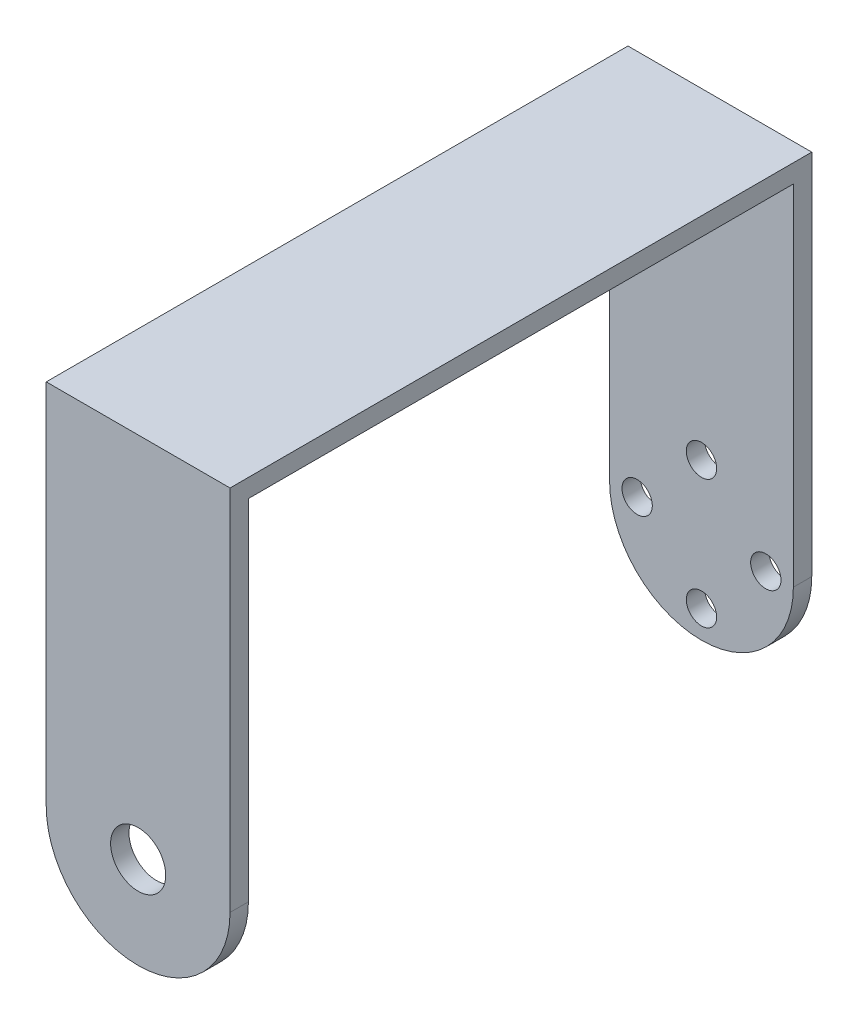
ISO-10303-21;
HEADER;
FILE_DESCRIPTION(('STEP AP214'),'2;1');
FILE_NAME('part.step','',(''),(''),'','','');
FILE_SCHEMA(('AUTOMOTIVE_DESIGN { 1 0 10303 214 1 1 1 1 }'));
ENDSEC;
DATA;
#1=APPLICATION_CONTEXT('core data for automotive mechanical design processes');
#2=APPLICATION_PROTOCOL_DEFINITION('international standard','automotive_design',2000,#1);
#3=PRODUCT_CONTEXT('',#1,'mechanical');
#4=PRODUCT('Part','Part','',(#3));
#5=PRODUCT_RELATED_PRODUCT_CATEGORY('part','',(#4));
#6=PRODUCT_DEFINITION_FORMATION('','',#4);
#7=PRODUCT_DEFINITION_CONTEXT('part definition',#1,'design');
#8=PRODUCT_DEFINITION('design','',#6,#7);
#9=PRODUCT_DEFINITION_SHAPE('','',#8);
#10=(LENGTH_UNIT() NAMED_UNIT(*) SI_UNIT(.MILLI.,.METRE.));
#11=(NAMED_UNIT(*) PLANE_ANGLE_UNIT() SI_UNIT($,.RADIAN.));
#12=(NAMED_UNIT(*) SI_UNIT($,.STERADIAN.) SOLID_ANGLE_UNIT());
#13=UNCERTAINTY_MEASURE_WITH_UNIT(LENGTH_MEASURE(1.E-05),#10,'distance_accuracy_value','');
#14=(GEOMETRIC_REPRESENTATION_CONTEXT(3) GLOBAL_UNCERTAINTY_ASSIGNED_CONTEXT((#13)) GLOBAL_UNIT_ASSIGNED_CONTEXT((#10,
#11,#12)) REPRESENTATION_CONTEXT('',''));
#15=CARTESIAN_POINT('',(0.,0.,0.));
#16=DIRECTION('',(0.,0.,1.));
#17=DIRECTION('',(1.,0.,0.));
#18=AXIS2_PLACEMENT_3D('',#15,#16,#17);
#19=CARTESIAN_POINT('',(0.,38.,63.3));
#20=DIRECTION('',(0.,1.,0.));
#21=DIRECTION('',(0.,0.,1.));
#22=AXIS2_PLACEMENT_3D('',#19,#20,#21);
#23=PLANE('',#22);
#24=DIRECTION('',(1.,0.,0.));
#25=VECTOR('',#24,1.);
#26=CARTESIAN_POINT('',(0.,38.,61.3));
#27=LINE('',#26,#25);
#28=CARTESIAN_POINT('',(0.,38.,61.3));
#29=VERTEX_POINT('',#28);
#30=CARTESIAN_POINT('',(20.,38.,61.3));
#31=VERTEX_POINT('',#30);
#32=EDGE_CURVE('E11',#29,#31,#27,.T.);
#33=ORIENTED_EDGE('',*,*,#32,.F.);
#34=DIRECTION('',(0.,0.,-1.));
#35=VECTOR('',#34,1.);
#36=CARTESIAN_POINT('',(0.,38.,63.3));
#37=LINE('',#36,#35);
#38=CARTESIAN_POINT('',(0.,38.,2.));
#39=VERTEX_POINT('',#38);
#40=EDGE_CURVE('E55',#29,#39,#37,.T.);
#41=ORIENTED_EDGE('',*,*,#40,.T.);
#42=DIRECTION('',(1.,0.,0.));
#43=VECTOR('',#42,1.);
#44=CARTESIAN_POINT('',(0.,38.,2.));
#45=LINE('',#44,#43);
#46=CARTESIAN_POINT('',(20.,38.,2.));
#47=VERTEX_POINT('',#46);
#48=EDGE_CURVE('E143',#39,#47,#45,.T.);
#49=ORIENTED_EDGE('',*,*,#48,.T.);
#50=DIRECTION('',(0.,0.,-1.));
#51=VECTOR('',#50,1.);
#52=CARTESIAN_POINT('',(20.,38.,63.3));
#53=LINE('',#52,#51);
#54=EDGE_CURVE('E113',#31,#47,#53,.T.);
#55=ORIENTED_EDGE('',*,*,#54,.F.);
#56=EDGE_LOOP('',(#33,#41,#49,#55));
#57=FACE_BOUND('',#56,.T.);
#58=ADVANCED_FACE('F39',(#57),#23,.F.);
#59=CARTESIAN_POINT('',(10.,0.,2.));
#60=DIRECTION('',(0.,0.,-1.));
#61=DIRECTION('',(-1.,0.,0.));
#62=AXIS2_PLACEMENT_3D('',#59,#60,#61);
#63=PLANE('',#62);
#64=CARTESIAN_POINT('',(10.,-7.,2.));
#65=DIRECTION('',(0.,0.,-1.));
#66=DIRECTION('',(-1.,0.,0.));
#67=AXIS2_PLACEMENT_3D('',#64,#65,#66);
#68=CIRCLE('',#67,1.65);
#69=CARTESIAN_POINT('',(8.35,-7.,2.));
#70=VERTEX_POINT('',#69);
#71=EDGE_CURVE('E188',#70,#70,#68,.F.);
#72=ORIENTED_EDGE('',*,*,#71,.F.);
#73=EDGE_LOOP('',(#72));
#74=FACE_BOUND('',#73,.T.);
#75=CARTESIAN_POINT('',(17.,0.,2.));
#76=DIRECTION('',(0.,0.,-1.));
#77=DIRECTION('',(-1.,0.,0.));
#78=AXIS2_PLACEMENT_3D('',#75,#76,#77);
#79=CIRCLE('',#78,1.65);
#80=CARTESIAN_POINT('',(15.35,0.,2.));
#81=VERTEX_POINT('',#80);
#82=EDGE_CURVE('E209',#81,#81,#79,.F.);
#83=ORIENTED_EDGE('',*,*,#82,.F.);
#84=EDGE_LOOP('',(#83));
#85=FACE_BOUND('',#84,.T.);
#86=CARTESIAN_POINT('',(9.99999999999995,6.99999999999993,2.));
#87=DIRECTION('',(0.,0.,-1.));
#88=DIRECTION('',(-1.,0.,0.));
#89=AXIS2_PLACEMENT_3D('',#86,#87,#88);
#90=CIRCLE('',#89,1.65);
#91=CARTESIAN_POINT('',(8.34999999999995,6.99999999999993,2.));
#92=VERTEX_POINT('',#91);
#93=EDGE_CURVE('E201',#92,#92,#90,.F.);
#94=ORIENTED_EDGE('',*,*,#93,.F.);
#95=EDGE_LOOP('',(#94));
#96=FACE_BOUND('',#95,.T.);
#97=CARTESIAN_POINT('',(3.00000000000004,-1.05818132034585E-13,2.));
#98=DIRECTION('',(0.,0.,-1.));
#99=DIRECTION('',(-1.,0.,0.));
#100=AXIS2_PLACEMENT_3D('',#97,#98,#99);
#101=CIRCLE('',#100,1.65);
#102=CARTESIAN_POINT('',(1.35000000000004,-1.05818132034585E-13,2.));
#103=VERTEX_POINT('',#102);
#104=EDGE_CURVE('E193',#103,#103,#101,.F.);
#105=ORIENTED_EDGE('',*,*,#104,.F.);
#106=EDGE_LOOP('',(#105));
#107=FACE_BOUND('',#106,.T.);
#108=ORIENTED_EDGE('',*,*,#48,.F.);
#109=DIRECTION('',(0.,-1.,0.));
#110=VECTOR('',#109,1.);
#111=CARTESIAN_POINT('',(0.,0.,2.));
#112=LINE('',#111,#110);
#113=CARTESIAN_POINT('',(0.,0.,2.));
#114=VERTEX_POINT('',#113);
#115=EDGE_CURVE('E63',#39,#114,#112,.T.);
#116=ORIENTED_EDGE('',*,*,#115,.T.);
#117=CARTESIAN_POINT('',(10.,0.,2.));
#118=DIRECTION('',(0.,0.,1.));
#119=DIRECTION('',(-1.,0.,0.));
#120=AXIS2_PLACEMENT_3D('',#117,#118,#119);
#121=CIRCLE('',#120,10.);
#122=CARTESIAN_POINT('',(20.,0.,2.));
#123=VERTEX_POINT('',#122);
#124=EDGE_CURVE('E95',#114,#123,#121,.T.);
#125=ORIENTED_EDGE('',*,*,#124,.T.);
#126=DIRECTION('',(0.,1.,0.));
#127=VECTOR('',#126,1.);
#128=CARTESIAN_POINT('',(20.,0.,2.));
#129=LINE('',#128,#127);
#130=EDGE_CURVE('E131',#123,#47,#129,.T.);
#131=ORIENTED_EDGE('',*,*,#130,.T.);
#132=EDGE_LOOP('',(#108,#116,#125,#131));
#133=FACE_BOUND('',#132,.T.);
#134=ADVANCED_FACE('F136',(#74,#85,#96,#107,#133),#63,.F.);
#135=CARTESIAN_POINT('',(10.,0.,2.));
#136=DIRECTION('',(0.,0.,-1.));
#137=DIRECTION('',(-1.,0.,0.));
#138=AXIS2_PLACEMENT_3D('',#135,#136,#137);
#139=CYLINDRICAL_SURFACE('',#138,10.);
#140=CARTESIAN_POINT('',(10.,0.,0.));
#141=DIRECTION('',(0.,0.,1.));
#142=DIRECTION('',(-1.,0.,0.));
#143=AXIS2_PLACEMENT_3D('',#140,#141,#142);
#144=CIRCLE('',#143,10.);
#145=CARTESIAN_POINT('',(0.,0.,0.));
#146=VERTEX_POINT('',#145);
#147=CARTESIAN_POINT('',(20.,0.,0.));
#148=VERTEX_POINT('',#147);
#149=EDGE_CURVE('E101',#146,#148,#144,.T.);
#150=ORIENTED_EDGE('',*,*,#149,.T.);
#151=DIRECTION('',(0.,0.,-1.));
#152=VECTOR('',#151,1.);
#153=CARTESIAN_POINT('',(20.,0.,2.));
#154=LINE('',#153,#152);
#155=EDGE_CURVE('E48',#123,#148,#154,.T.);
#156=ORIENTED_EDGE('',*,*,#155,.F.);
#157=ORIENTED_EDGE('',*,*,#124,.F.);
#158=DIRECTION('',(0.,0.,-1.));
#159=VECTOR('',#158,1.);
#160=CARTESIAN_POINT('',(0.,0.,2.));
#161=LINE('',#160,#159);
#162=EDGE_CURVE('E85',#114,#146,#161,.T.);
#163=ORIENTED_EDGE('',*,*,#162,.T.);
#164=EDGE_LOOP('',(#150,#156,#157,#163));
#165=FACE_BOUND('',#164,.T.);
#166=ADVANCED_FACE('F41',(#165),#139,.T.);
#167=CARTESIAN_POINT('',(20.,0.,2.));
#168=DIRECTION('',(-1.,0.,0.));
#169=DIRECTION('',(0.,0.,1.));
#170=AXIS2_PLACEMENT_3D('',#167,#168,#169);
#171=PLANE('',#170);
#172=DIRECTION('',(0.,1.,0.));
#173=VECTOR('',#172,1.);
#174=CARTESIAN_POINT('',(20.,40.,63.3));
#175=LINE('',#174,#173);
#176=CARTESIAN_POINT('',(20.,0.,63.3));
#177=VERTEX_POINT('',#176);
#178=CARTESIAN_POINT('',(20.,40.,63.3));
#179=VERTEX_POINT('',#178);
#180=EDGE_CURVE('E151',#177,#179,#175,.T.);
#181=ORIENTED_EDGE('',*,*,#180,.F.);
#182=DIRECTION('',(0.,0.,1.));
#183=VECTOR('',#182,1.);
#184=CARTESIAN_POINT('',(20.,0.,61.3));
#185=LINE('',#184,#183);
#186=CARTESIAN_POINT('',(20.,0.,61.3));
#187=VERTEX_POINT('',#186);
#188=EDGE_CURVE('E161',#187,#177,#185,.T.);
#189=ORIENTED_EDGE('',*,*,#188,.F.);
#190=DIRECTION('',(0.,1.,0.));
#191=VECTOR('',#190,1.);
#192=CARTESIAN_POINT('',(20.,0.,61.3));
#193=LINE('',#192,#191);
#194=EDGE_CURVE('E165',#187,#31,#193,.T.);
#195=ORIENTED_EDGE('',*,*,#194,.T.);
#196=ORIENTED_EDGE('',*,*,#54,.T.);
#197=ORIENTED_EDGE('',*,*,#130,.F.);
#198=ORIENTED_EDGE('',*,*,#155,.T.);
#199=DIRECTION('',(0.,1.,0.));
#200=VECTOR('',#199,1.);
#201=CARTESIAN_POINT('',(20.,0.,0.));
#202=LINE('',#201,#200);
#203=CARTESIAN_POINT('',(20.,40.,0.));
#204=VERTEX_POINT('',#203);
#205=EDGE_CURVE('E106',#148,#204,#202,.T.);
#206=ORIENTED_EDGE('',*,*,#205,.T.);
#207=DIRECTION('',(0.,0.,-1.));
#208=VECTOR('',#207,1.);
#209=CARTESIAN_POINT('',(20.,40.,2.));
#210=LINE('',#209,#208);
#211=EDGE_CURVE('E122',#179,#204,#210,.T.);
#212=ORIENTED_EDGE('',*,*,#211,.F.);
#213=EDGE_LOOP('',(#181,#189,#195,#196,#197,#198,#206,#212));
#214=FACE_BOUND('',#213,.T.);
#215=ADVANCED_FACE('F127',(#214),#171,.F.);
#216=CARTESIAN_POINT('',(0.,40.,2.));
#217=DIRECTION('',(0.,-1.,0.));
#218=DIRECTION('',(0.,0.,-1.));
#219=AXIS2_PLACEMENT_3D('',#216,#217,#218);
#220=PLANE('',#219);
#221=ORIENTED_EDGE('',*,*,#211,.T.);
#222=DIRECTION('',(-1.,0.,0.));
#223=VECTOR('',#222,1.);
#224=CARTESIAN_POINT('',(0.,40.,0.));
#225=LINE('',#224,#223);
#226=CARTESIAN_POINT('',(0.,40.,0.));
#227=VERTEX_POINT('',#226);
#228=EDGE_CURVE('E96',#204,#227,#225,.T.);
#229=ORIENTED_EDGE('',*,*,#228,.T.);
#230=DIRECTION('',(0.,0.,-1.));
#231=VECTOR('',#230,1.);
#232=CARTESIAN_POINT('',(0.,40.,2.));
#233=LINE('',#232,#231);
#234=CARTESIAN_POINT('',(0.,40.,63.3));
#235=VERTEX_POINT('',#234);
#236=EDGE_CURVE('E89',#235,#227,#233,.T.);
#237=ORIENTED_EDGE('',*,*,#236,.F.);
#238=DIRECTION('',(-1.,0.,0.));
#239=VECTOR('',#238,1.);
#240=CARTESIAN_POINT('',(0.,40.,63.3));
#241=LINE('',#240,#239);
#242=EDGE_CURVE('E142',#179,#235,#241,.T.);
#243=ORIENTED_EDGE('',*,*,#242,.F.);
#244=EDGE_LOOP('',(#221,#229,#237,#243));
#245=FACE_BOUND('',#244,.T.);
#246=ADVANCED_FACE('F261',(#245),#220,.F.);
#247=CARTESIAN_POINT('',(0.,0.,2.));
#248=DIRECTION('',(1.,0.,0.));
#249=DIRECTION('',(0.,0.,-1.));
#250=AXIS2_PLACEMENT_3D('',#247,#248,#249);
#251=PLANE('',#250);
#252=ORIENTED_EDGE('',*,*,#236,.T.);
#253=DIRECTION('',(0.,-1.,0.));
#254=VECTOR('',#253,1.);
#255=CARTESIAN_POINT('',(0.,0.,0.));
#256=LINE('',#255,#254);
#257=EDGE_CURVE('E82',#227,#146,#256,.T.);
#258=ORIENTED_EDGE('',*,*,#257,.T.);
#259=ORIENTED_EDGE('',*,*,#162,.F.);
#260=ORIENTED_EDGE('',*,*,#115,.F.);
#261=ORIENTED_EDGE('',*,*,#40,.F.);
#262=DIRECTION('',(0.,-1.,0.));
#263=VECTOR('',#262,1.);
#264=CARTESIAN_POINT('',(0.,0.,61.3));
#265=LINE('',#264,#263);
#266=CARTESIAN_POINT('',(0.,0.,61.3));
#267=VERTEX_POINT('',#266);
#268=EDGE_CURVE('E174',#29,#267,#265,.T.);
#269=ORIENTED_EDGE('',*,*,#268,.T.);
#270=DIRECTION('',(0.,0.,1.));
#271=VECTOR('',#270,1.);
#272=CARTESIAN_POINT('',(0.,0.,61.3));
#273=LINE('',#272,#271);
#274=CARTESIAN_POINT('',(0.,0.,63.3));
#275=VERTEX_POINT('',#274);
#276=EDGE_CURVE('E147',#267,#275,#273,.T.);
#277=ORIENTED_EDGE('',*,*,#276,.T.);
#278=DIRECTION('',(0.,-1.,0.));
#279=VECTOR('',#278,1.);
#280=CARTESIAN_POINT('',(0.,40.,63.3));
#281=LINE('',#280,#279);
#282=EDGE_CURVE('E146',#235,#275,#281,.T.);
#283=ORIENTED_EDGE('',*,*,#282,.F.);
#284=EDGE_LOOP('',(#252,#258,#259,#260,#261,#269,#277,#283));
#285=FACE_BOUND('',#284,.T.);
#286=ADVANCED_FACE('F84',(#285),#251,.F.);
#287=CARTESIAN_POINT('',(10.,0.,0.));
#288=DIRECTION('',(0.,0.,-1.));
#289=DIRECTION('',(-1.,0.,0.));
#290=AXIS2_PLACEMENT_3D('',#287,#288,#289);
#291=PLANE('',#290);
#292=CARTESIAN_POINT('',(10.,-7.,0.));
#293=DIRECTION('',(0.,0.,-1.));
#294=DIRECTION('',(-1.,0.,0.));
#295=AXIS2_PLACEMENT_3D('',#292,#293,#294);
#296=CIRCLE('',#295,1.65);
#297=CARTESIAN_POINT('',(8.35,-7.,0.));
#298=VERTEX_POINT('',#297);
#299=EDGE_CURVE('E213',#298,#298,#296,.T.);
#300=ORIENTED_EDGE('',*,*,#299,.F.);
#301=EDGE_LOOP('',(#300));
#302=FACE_BOUND('',#301,.T.);
#303=CARTESIAN_POINT('',(17.,0.,0.));
#304=DIRECTION('',(0.,0.,-1.));
#305=DIRECTION('',(-1.,0.,0.));
#306=AXIS2_PLACEMENT_3D('',#303,#304,#305);
#307=CIRCLE('',#306,1.65);
#308=CARTESIAN_POINT('',(15.35,0.,0.));
#309=VERTEX_POINT('',#308);
#310=EDGE_CURVE('E205',#309,#309,#307,.T.);
#311=ORIENTED_EDGE('',*,*,#310,.F.);
#312=EDGE_LOOP('',(#311));
#313=FACE_BOUND('',#312,.T.);
#314=CARTESIAN_POINT('',(9.99999999999995,6.99999999999993,0.));
#315=DIRECTION('',(0.,0.,-1.));
#316=DIRECTION('',(-1.,0.,0.));
#317=AXIS2_PLACEMENT_3D('',#314,#315,#316);
#318=CIRCLE('',#317,1.65);
#319=CARTESIAN_POINT('',(8.34999999999995,6.99999999999993,0.));
#320=VERTEX_POINT('',#319);
#321=EDGE_CURVE('E197',#320,#320,#318,.T.);
#322=ORIENTED_EDGE('',*,*,#321,.F.);
#323=EDGE_LOOP('',(#322));
#324=FACE_BOUND('',#323,.T.);
#325=CARTESIAN_POINT('',(3.00000000000004,-1.05818132034585E-13,0.));
#326=DIRECTION('',(0.,0.,-1.));
#327=DIRECTION('',(-1.,0.,0.));
#328=AXIS2_PLACEMENT_3D('',#325,#326,#327);
#329=CIRCLE('',#328,1.65);
#330=CARTESIAN_POINT('',(1.35000000000004,-1.05818132034585E-13,0.));
#331=VERTEX_POINT('',#330);
#332=EDGE_CURVE('E189',#331,#331,#329,.T.);
#333=ORIENTED_EDGE('',*,*,#332,.F.);
#334=EDGE_LOOP('',(#333));
#335=FACE_BOUND('',#334,.T.);
#336=ORIENTED_EDGE('',*,*,#149,.F.);
#337=ORIENTED_EDGE('',*,*,#257,.F.);
#338=ORIENTED_EDGE('',*,*,#228,.F.);
#339=ORIENTED_EDGE('',*,*,#205,.F.);
#340=EDGE_LOOP('',(#336,#337,#338,#339));
#341=FACE_BOUND('',#340,.T.);
#342=ADVANCED_FACE('F104',(#302,#313,#324,#335,#341),#291,.T.);
#343=CARTESIAN_POINT('',(0.,0.,63.3));
#344=DIRECTION('',(0.,0.,1.));
#345=DIRECTION('',(1.,0.,0.));
#346=AXIS2_PLACEMENT_3D('',#343,#344,#345);
#347=PLANE('',#346);
#348=CARTESIAN_POINT('',(10.,0.,63.3));
#349=DIRECTION('',(0.,0.,1.));
#350=DIRECTION('',(1.,0.,0.));
#351=AXIS2_PLACEMENT_3D('',#348,#349,#350);
#352=CIRCLE('',#351,3.);
#353=CARTESIAN_POINT('',(13.,0.,63.3));
#354=VERTEX_POINT('',#353);
#355=EDGE_CURVE('E184',#354,#354,#352,.T.);
#356=ORIENTED_EDGE('',*,*,#355,.F.);
#357=EDGE_LOOP('',(#356));
#358=FACE_BOUND('',#357,.T.);
#359=ORIENTED_EDGE('',*,*,#282,.T.);
#360=CARTESIAN_POINT('',(10.,0.,63.3));
#361=DIRECTION('',(0.,0.,1.));
#362=DIRECTION('',(-1.,0.,0.));
#363=AXIS2_PLACEMENT_3D('',#360,#361,#362);
#364=CIRCLE('',#363,10.);
#365=EDGE_CURVE('E166',#275,#177,#364,.T.);
#366=ORIENTED_EDGE('',*,*,#365,.T.);
#367=ORIENTED_EDGE('',*,*,#180,.T.);
#368=ORIENTED_EDGE('',*,*,#242,.T.);
#369=EDGE_LOOP('',(#359,#366,#367,#368));
#370=FACE_BOUND('',#369,.T.);
#371=ADVANCED_FACE('F253',(#358,#370),#347,.T.);
#372=CARTESIAN_POINT('',(10.,0.,61.3));
#373=DIRECTION('',(0.,0.,1.));
#374=DIRECTION('',(-1.,0.,0.));
#375=AXIS2_PLACEMENT_3D('',#372,#373,#374);
#376=PLANE('',#375);
#377=CARTESIAN_POINT('',(10.,0.,61.3));
#378=DIRECTION('',(0.,0.,1.));
#379=DIRECTION('',(1.,0.,0.));
#380=AXIS2_PLACEMENT_3D('',#377,#378,#379);
#381=CIRCLE('',#380,3.);
#382=CARTESIAN_POINT('',(13.,0.,61.3));
#383=VERTEX_POINT('',#382);
#384=EDGE_CURVE('E171',#383,#383,#381,.F.);
#385=ORIENTED_EDGE('',*,*,#384,.F.);
#386=EDGE_LOOP('',(#385));
#387=FACE_BOUND('',#386,.T.);
#388=ORIENTED_EDGE('',*,*,#268,.F.);
#389=ORIENTED_EDGE('',*,*,#32,.T.);
#390=ORIENTED_EDGE('',*,*,#194,.F.);
#391=CARTESIAN_POINT('',(10.,0.,61.3));
#392=DIRECTION('',(0.,0.,1.));
#393=DIRECTION('',(-1.,0.,0.));
#394=AXIS2_PLACEMENT_3D('',#391,#392,#393);
#395=CIRCLE('',#394,10.);
#396=EDGE_CURVE('E170',#267,#187,#395,.T.);
#397=ORIENTED_EDGE('',*,*,#396,.F.);
#398=EDGE_LOOP('',(#388,#389,#390,#397));
#399=FACE_BOUND('',#398,.T.);
#400=ADVANCED_FACE('F336',(#387,#399),#376,.F.);
#401=CARTESIAN_POINT('',(10.,0.,61.3));
#402=DIRECTION('',(0.,0.,1.));
#403=DIRECTION('',(1.,0.,0.));
#404=AXIS2_PLACEMENT_3D('',#401,#402,#403);
#405=CYLINDRICAL_SURFACE('',#404,10.);
#406=ORIENTED_EDGE('',*,*,#365,.F.);
#407=ORIENTED_EDGE('',*,*,#276,.F.);
#408=ORIENTED_EDGE('',*,*,#396,.T.);
#409=ORIENTED_EDGE('',*,*,#188,.T.);
#410=EDGE_LOOP('',(#406,#407,#408,#409));
#411=FACE_BOUND('',#410,.T.);
#412=ADVANCED_FACE('F245',(#411),#405,.T.);
#413=CARTESIAN_POINT('',(10.,0.,-0.001000000000001));
#414=DIRECTION('',(0.,0.,1.));
#415=DIRECTION('',(1.,0.,0.));
#416=AXIS2_PLACEMENT_3D('',#413,#414,#415);
#417=CYLINDRICAL_SURFACE('',#416,3.);
#418=ORIENTED_EDGE('',*,*,#355,.T.);
#419=EDGE_LOOP('',(#418));
#420=FACE_BOUND('',#419,.T.);
#421=ORIENTED_EDGE('',*,*,#384,.T.);
#422=EDGE_LOOP('',(#421));
#423=FACE_BOUND('',#422,.T.);
#424=ADVANCED_FACE('F235',(#420,#423),#417,.F.);
#425=CARTESIAN_POINT('',(3.00000000000004,-1.05818132034585E-13,63.301));
#426=DIRECTION('',(0.,0.,-1.));
#427=DIRECTION('',(-1.,0.,0.));
#428=AXIS2_PLACEMENT_3D('',#425,#426,#427);
#429=CYLINDRICAL_SURFACE('',#428,1.65);
#430=ORIENTED_EDGE('',*,*,#332,.T.);
#431=EDGE_LOOP('',(#430));
#432=FACE_BOUND('',#431,.T.);
#433=ORIENTED_EDGE('',*,*,#104,.T.);
#434=EDGE_LOOP('',(#433));
#435=FACE_BOUND('',#434,.T.);
#436=ADVANCED_FACE('F232',(#432,#435),#429,.F.);
#437=CARTESIAN_POINT('',(9.99999999999995,6.99999999999993,63.301));
#438=DIRECTION('',(0.,0.,-1.));
#439=DIRECTION('',(-1.,0.,0.));
#440=AXIS2_PLACEMENT_3D('',#437,#438,#439);
#441=CYLINDRICAL_SURFACE('',#440,1.65);
#442=ORIENTED_EDGE('',*,*,#321,.T.);
#443=EDGE_LOOP('',(#442));
#444=FACE_BOUND('',#443,.T.);
#445=ORIENTED_EDGE('',*,*,#93,.T.);
#446=EDGE_LOOP('',(#445));
#447=FACE_BOUND('',#446,.T.);
#448=ADVANCED_FACE('F234',(#444,#447),#441,.F.);
#449=CARTESIAN_POINT('',(17.,0.,63.301));
#450=DIRECTION('',(0.,0.,-1.));
#451=DIRECTION('',(-1.,0.,0.));
#452=AXIS2_PLACEMENT_3D('',#449,#450,#451);
#453=CYLINDRICAL_SURFACE('',#452,1.65);
#454=ORIENTED_EDGE('',*,*,#310,.T.);
#455=EDGE_LOOP('',(#454));
#456=FACE_BOUND('',#455,.T.);
#457=ORIENTED_EDGE('',*,*,#82,.T.);
#458=EDGE_LOOP('',(#457));
#459=FACE_BOUND('',#458,.T.);
#460=ADVANCED_FACE('F242',(#456,#459),#453,.F.);
#461=CARTESIAN_POINT('',(10.,-7.,63.301));
#462=DIRECTION('',(0.,0.,-1.));
#463=DIRECTION('',(-1.,0.,0.));
#464=AXIS2_PLACEMENT_3D('',#461,#462,#463);
#465=CYLINDRICAL_SURFACE('',#464,1.65);
#466=ORIENTED_EDGE('',*,*,#299,.T.);
#467=EDGE_LOOP('',(#466));
#468=FACE_BOUND('',#467,.T.);
#469=ORIENTED_EDGE('',*,*,#71,.T.);
#470=EDGE_LOOP('',(#469));
#471=FACE_BOUND('',#470,.T.);
#472=ADVANCED_FACE('F221',(#468,#471),#465,.F.);
#473=CLOSED_SHELL('',(#58,#134,#166,#215,#246,#286,#342,#371,#400,#412,#424,#436,#448,#460,#472));
#474=MANIFOLD_SOLID_BREP('B2',#473);
#475=ADVANCED_BREP_SHAPE_REPRESENTATION('',(#18,#474),#14);
#476=SHAPE_DEFINITION_REPRESENTATION(#9,#475);
ENDSEC;
END-ISO-10303-21;
